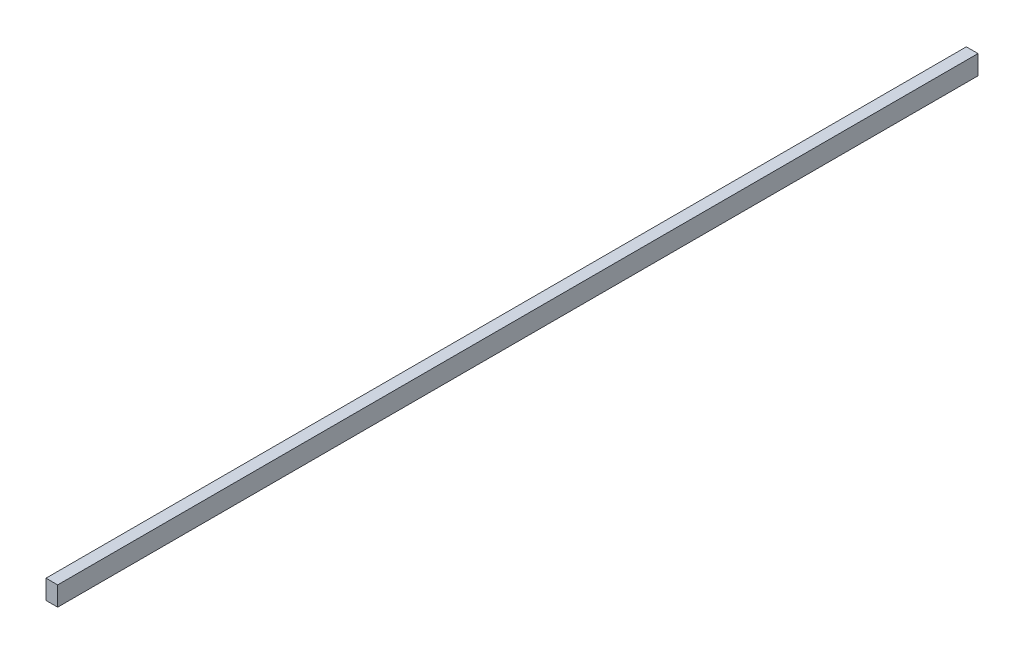
ISO-10303-21;
HEADER;
FILE_DESCRIPTION(('STEP AP214'),'2;1');
FILE_NAME('part.step','',(''),(''),'','','');
FILE_SCHEMA(('AUTOMOTIVE_DESIGN { 1 0 10303 214 1 1 1 1 }'));
ENDSEC;
DATA;
#1=APPLICATION_CONTEXT('core data for automotive mechanical design processes');
#2=APPLICATION_PROTOCOL_DEFINITION('international standard','automotive_design',2000,#1);
#3=PRODUCT_CONTEXT('',#1,'mechanical');
#4=PRODUCT('Part','Part','',(#3));
#5=PRODUCT_RELATED_PRODUCT_CATEGORY('part','',(#4));
#6=PRODUCT_DEFINITION_FORMATION('','',#4);
#7=PRODUCT_DEFINITION_CONTEXT('part definition',#1,'design');
#8=PRODUCT_DEFINITION('design','',#6,#7);
#9=PRODUCT_DEFINITION_SHAPE('','',#8);
#10=(LENGTH_UNIT() NAMED_UNIT(*) SI_UNIT(.MILLI.,.METRE.));
#11=(NAMED_UNIT(*) PLANE_ANGLE_UNIT() SI_UNIT($,.RADIAN.));
#12=(NAMED_UNIT(*) SI_UNIT($,.STERADIAN.) SOLID_ANGLE_UNIT());
#13=UNCERTAINTY_MEASURE_WITH_UNIT(LENGTH_MEASURE(1.E-05),#10,'distance_accuracy_value','');
#14=(GEOMETRIC_REPRESENTATION_CONTEXT(3) GLOBAL_UNCERTAINTY_ASSIGNED_CONTEXT((#13)) GLOBAL_UNIT_ASSIGNED_CONTEXT((#10,
#11,#12)) REPRESENTATION_CONTEXT('',''));
#15=CARTESIAN_POINT('',(0.,0.,0.));
#16=DIRECTION('',(0.,0.,1.));
#17=DIRECTION('',(1.,0.,0.));
#18=AXIS2_PLACEMENT_3D('',#15,#16,#17);
#19=CARTESIAN_POINT('',(0.,0.,3000.));
#20=DIRECTION('',(1.,0.,0.));
#21=DIRECTION('',(0.,0.,-1.));
#22=AXIS2_PLACEMENT_3D('',#19,#20,#21);
#23=PLANE('',#22);
#24=DIRECTION('',(0.,-1.,0.));
#25=VECTOR('',#24,1.);
#26=CARTESIAN_POINT('',(0.,0.,0.));
#27=LINE('',#26,#25);
#28=CARTESIAN_POINT('',(0.,63.,0.));
#29=VERTEX_POINT('',#28);
#30=CARTESIAN_POINT('',(0.,0.,0.));
#31=VERTEX_POINT('',#30);
#32=EDGE_CURVE('E96',#29,#31,#27,.T.);
#33=ORIENTED_EDGE('',*,*,#32,.T.);
#34=DIRECTION('',(0.,0.,-1.));
#35=VECTOR('',#34,1.);
#36=CARTESIAN_POINT('',(0.,0.,3000.));
#37=LINE('',#36,#35);
#38=CARTESIAN_POINT('',(0.,0.,3000.));
#39=VERTEX_POINT('',#38);
#40=EDGE_CURVE('E11',#39,#31,#37,.T.);
#41=ORIENTED_EDGE('',*,*,#40,.F.);
#42=DIRECTION('',(0.,-1.,0.));
#43=VECTOR('',#42,1.);
#44=CARTESIAN_POINT('',(0.,0.,3000.));
#45=LINE('',#44,#43);
#46=CARTESIAN_POINT('',(0.,63.,3000.));
#47=VERTEX_POINT('',#46);
#48=EDGE_CURVE('E84',#47,#39,#45,.T.);
#49=ORIENTED_EDGE('',*,*,#48,.F.);
#50=DIRECTION('',(0.,0.,-1.));
#51=VECTOR('',#50,1.);
#52=CARTESIAN_POINT('',(0.,63.,3000.));
#53=LINE('',#52,#51);
#54=EDGE_CURVE('E92',#47,#29,#53,.T.);
#55=ORIENTED_EDGE('',*,*,#54,.T.);
#56=EDGE_LOOP('',(#33,#41,#49,#55));
#57=FACE_BOUND('',#56,.T.);
#58=ADVANCED_FACE('F33',(#57),#23,.F.);
#59=CARTESIAN_POINT('',(0.,0.,3000.));
#60=DIRECTION('',(0.,1.,0.));
#61=DIRECTION('',(0.,0.,1.));
#62=AXIS2_PLACEMENT_3D('',#59,#60,#61);
#63=PLANE('',#62);
#64=DIRECTION('',(1.,0.,0.));
#65=VECTOR('',#64,1.);
#66=CARTESIAN_POINT('',(0.,0.,0.));
#67=LINE('',#66,#65);
#68=CARTESIAN_POINT('',(38.,0.,0.));
#69=VERTEX_POINT('',#68);
#70=EDGE_CURVE('E88',#31,#69,#67,.T.);
#71=ORIENTED_EDGE('',*,*,#70,.T.);
#72=DIRECTION('',(0.,0.,-1.));
#73=VECTOR('',#72,1.);
#74=CARTESIAN_POINT('',(38.,0.,3000.));
#75=LINE('',#74,#73);
#76=CARTESIAN_POINT('',(38.,0.,3000.));
#77=VERTEX_POINT('',#76);
#78=EDGE_CURVE('E41',#77,#69,#75,.T.);
#79=ORIENTED_EDGE('',*,*,#78,.F.);
#80=DIRECTION('',(1.,0.,0.));
#81=VECTOR('',#80,1.);
#82=CARTESIAN_POINT('',(0.,0.,3000.));
#83=LINE('',#82,#81);
#84=EDGE_CURVE('E79',#39,#77,#83,.T.);
#85=ORIENTED_EDGE('',*,*,#84,.F.);
#86=ORIENTED_EDGE('',*,*,#40,.T.);
#87=EDGE_LOOP('',(#71,#79,#85,#86));
#88=FACE_BOUND('',#87,.T.);
#89=ADVANCED_FACE('F87',(#88),#63,.F.);
#90=CARTESIAN_POINT('',(38.,0.,3000.));
#91=DIRECTION('',(-1.,0.,0.));
#92=DIRECTION('',(0.,0.,1.));
#93=AXIS2_PLACEMENT_3D('',#90,#91,#92);
#94=PLANE('',#93);
#95=DIRECTION('',(0.,1.,0.));
#96=VECTOR('',#95,1.);
#97=CARTESIAN_POINT('',(38.,0.,0.));
#98=LINE('',#97,#96);
#99=CARTESIAN_POINT('',(38.,63.,0.));
#100=VERTEX_POINT('',#99);
#101=EDGE_CURVE('E66',#69,#100,#98,.T.);
#102=ORIENTED_EDGE('',*,*,#101,.T.);
#103=DIRECTION('',(0.,0.,-1.));
#104=VECTOR('',#103,1.);
#105=CARTESIAN_POINT('',(38.,63.,3000.));
#106=LINE('',#105,#104);
#107=CARTESIAN_POINT('',(38.,63.,3000.));
#108=VERTEX_POINT('',#107);
#109=EDGE_CURVE('E89',#108,#100,#106,.T.);
#110=ORIENTED_EDGE('',*,*,#109,.F.);
#111=DIRECTION('',(0.,1.,0.));
#112=VECTOR('',#111,1.);
#113=CARTESIAN_POINT('',(38.,0.,3000.));
#114=LINE('',#113,#112);
#115=EDGE_CURVE('E82',#77,#108,#114,.T.);
#116=ORIENTED_EDGE('',*,*,#115,.F.);
#117=ORIENTED_EDGE('',*,*,#78,.T.);
#118=EDGE_LOOP('',(#102,#110,#116,#117));
#119=FACE_BOUND('',#118,.T.);
#120=ADVANCED_FACE('F90',(#119),#94,.F.);
#121=CARTESIAN_POINT('',(0.,63.,3000.));
#122=DIRECTION('',(0.,-1.,0.));
#123=DIRECTION('',(0.,0.,-1.));
#124=AXIS2_PLACEMENT_3D('',#121,#122,#123);
#125=PLANE('',#124);
#126=DIRECTION('',(-1.,0.,0.));
#127=VECTOR('',#126,1.);
#128=CARTESIAN_POINT('',(0.,63.,0.));
#129=LINE('',#128,#127);
#130=EDGE_CURVE('E72',#100,#29,#129,.T.);
#131=ORIENTED_EDGE('',*,*,#130,.T.);
#132=ORIENTED_EDGE('',*,*,#54,.F.);
#133=DIRECTION('',(-1.,0.,0.));
#134=VECTOR('',#133,1.);
#135=CARTESIAN_POINT('',(0.,63.,3000.));
#136=LINE('',#135,#134);
#137=EDGE_CURVE('E49',#108,#47,#136,.T.);
#138=ORIENTED_EDGE('',*,*,#137,.F.);
#139=ORIENTED_EDGE('',*,*,#109,.T.);
#140=EDGE_LOOP('',(#131,#132,#138,#139));
#141=FACE_BOUND('',#140,.T.);
#142=ADVANCED_FACE('F103',(#141),#125,.F.);
#143=CARTESIAN_POINT('',(0.,0.,3000.));
#144=DIRECTION('',(0.,0.,-1.));
#145=DIRECTION('',(-1.,0.,0.));
#146=AXIS2_PLACEMENT_3D('',#143,#144,#145);
#147=PLANE('',#146);
#148=ORIENTED_EDGE('',*,*,#48,.T.);
#149=ORIENTED_EDGE('',*,*,#84,.T.);
#150=ORIENTED_EDGE('',*,*,#115,.T.);
#151=ORIENTED_EDGE('',*,*,#137,.T.);
#152=EDGE_LOOP('',(#148,#149,#150,#151));
#153=FACE_BOUND('',#152,.T.);
#154=ADVANCED_FACE('F80',(#153),#147,.F.);
#155=CARTESIAN_POINT('',(0.,0.,0.));
#156=DIRECTION('',(0.,0.,-1.));
#157=DIRECTION('',(-1.,0.,0.));
#158=AXIS2_PLACEMENT_3D('',#155,#156,#157);
#159=PLANE('',#158);
#160=ORIENTED_EDGE('',*,*,#32,.F.);
#161=ORIENTED_EDGE('',*,*,#130,.F.);
#162=ORIENTED_EDGE('',*,*,#101,.F.);
#163=ORIENTED_EDGE('',*,*,#70,.F.);
#164=EDGE_LOOP('',(#160,#161,#162,#163));
#165=FACE_BOUND('',#164,.T.);
#166=ADVANCED_FACE('F106',(#165),#159,.T.);
#167=CLOSED_SHELL('',(#58,#89,#120,#142,#154,#166));
#168=MANIFOLD_SOLID_BREP('B2',#167);
#169=ADVANCED_BREP_SHAPE_REPRESENTATION('',(#18,#168),#14);
#170=SHAPE_DEFINITION_REPRESENTATION(#9,#169);
ENDSEC;
END-ISO-10303-21;
